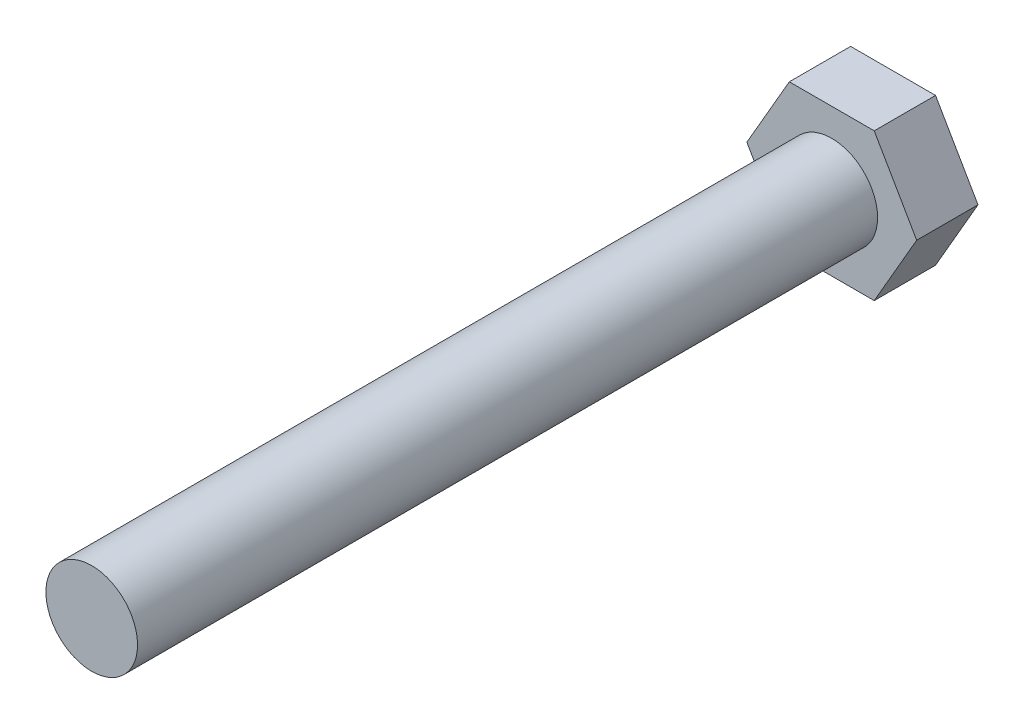
ISO-10303-21;
HEADER;
FILE_DESCRIPTION(('STEP AP214'),'2;1');
FILE_NAME('part.step','',(''),(''),'','','');
FILE_SCHEMA(('AUTOMOTIVE_DESIGN { 1 0 10303 214 1 1 1 1 }'));
ENDSEC;
DATA;
#1=APPLICATION_CONTEXT('core data for automotive mechanical design processes');
#2=APPLICATION_PROTOCOL_DEFINITION('international standard','automotive_design',2000,#1);
#3=PRODUCT_CONTEXT('',#1,'mechanical');
#4=PRODUCT('Part','Part','',(#3));
#5=PRODUCT_RELATED_PRODUCT_CATEGORY('part','',(#4));
#6=PRODUCT_DEFINITION_FORMATION('','',#4);
#7=PRODUCT_DEFINITION_CONTEXT('part definition',#1,'design');
#8=PRODUCT_DEFINITION('design','',#6,#7);
#9=PRODUCT_DEFINITION_SHAPE('','',#8);
#10=(LENGTH_UNIT() NAMED_UNIT(*) SI_UNIT(.MILLI.,.METRE.));
#11=(NAMED_UNIT(*) PLANE_ANGLE_UNIT() SI_UNIT($,.RADIAN.));
#12=(NAMED_UNIT(*) SI_UNIT($,.STERADIAN.) SOLID_ANGLE_UNIT());
#13=UNCERTAINTY_MEASURE_WITH_UNIT(LENGTH_MEASURE(1.E-05),#10,'distance_accuracy_value','');
#14=(GEOMETRIC_REPRESENTATION_CONTEXT(3) GLOBAL_UNCERTAINTY_ASSIGNED_CONTEXT((#13)) GLOBAL_UNIT_ASSIGNED_CONTEXT((#10,
#11,#12)) REPRESENTATION_CONTEXT('',''));
#15=CARTESIAN_POINT('',(0.,0.,0.));
#16=DIRECTION('',(0.,0.,1.));
#17=DIRECTION('',(1.,0.,0.));
#18=AXIS2_PLACEMENT_3D('',#15,#16,#17);
#19=CARTESIAN_POINT('',(0.,0.,63.));
#20=DIRECTION('',(0.,0.,-1.));
#21=DIRECTION('',(-1.,0.,0.));
#22=AXIS2_PLACEMENT_3D('',#19,#20,#21);
#23=CYLINDRICAL_SURFACE('',#22,3.9);
#24=CARTESIAN_POINT('',(0.,0.,63.));
#25=DIRECTION('',(0.,0.,1.));
#26=DIRECTION('',(1.,0.,0.));
#27=AXIS2_PLACEMENT_3D('',#24,#25,#26);
#28=CIRCLE('',#27,3.9);
#29=CARTESIAN_POINT('',(3.9,0.,63.));
#30=VERTEX_POINT('',#29);
#31=EDGE_CURVE('E11',#30,#30,#28,.T.);
#32=ORIENTED_EDGE('',*,*,#31,.F.);
#33=EDGE_LOOP('',(#32));
#34=FACE_BOUND('',#33,.T.);
#35=CARTESIAN_POINT('',(0.,0.,0.));
#36=DIRECTION('',(0.,0.,1.));
#37=DIRECTION('',(1.,0.,0.));
#38=AXIS2_PLACEMENT_3D('',#35,#36,#37);
#39=CIRCLE('',#38,3.9);
#40=CARTESIAN_POINT('',(3.9,0.,0.));
#41=VERTEX_POINT('',#40);
#42=EDGE_CURVE('E48',#41,#41,#39,.T.);
#43=ORIENTED_EDGE('',*,*,#42,.T.);
#44=EDGE_LOOP('',(#43));
#45=FACE_BOUND('',#44,.T.);
#46=ADVANCED_FACE('F45',(#34,#45),#23,.T.);
#47=CARTESIAN_POINT('',(0.,0.,63.));
#48=DIRECTION('',(0.,0.,1.));
#49=DIRECTION('',(1.,0.,0.));
#50=AXIS2_PLACEMENT_3D('',#47,#48,#49);
#51=PLANE('',#50);
#52=ORIENTED_EDGE('',*,*,#31,.T.);
#53=EDGE_LOOP('',(#52));
#54=FACE_BOUND('',#53,.T.);
#55=ADVANCED_FACE('F189',(#54),#51,.T.);
#56=CARTESIAN_POINT('',(-3.61421268512705,6.26000000000001,-5.22));
#57=DIRECTION('',(0.,-1.,0.));
#58=DIRECTION('',(1.,0.,0.));
#59=AXIS2_PLACEMENT_3D('',#56,#57,#58);
#60=PLANE('',#59);
#61=DIRECTION('',(1.,0.,0.));
#62=VECTOR('',#61,1.);
#63=CARTESIAN_POINT('',(-3.61421268512705,6.26000000000001,0.));
#64=LINE('',#63,#62);
#65=CARTESIAN_POINT('',(-3.61421268512705,6.26000000000001,0.));
#66=VERTEX_POINT('',#65);
#67=CARTESIAN_POINT('',(3.61421268512706,6.26000000000001,0.));
#68=VERTEX_POINT('',#67);
#69=EDGE_CURVE('E135',#66,#68,#64,.T.);
#70=ORIENTED_EDGE('',*,*,#69,.T.);
#71=DIRECTION('',(0.,0.,1.));
#72=VECTOR('',#71,1.);
#73=CARTESIAN_POINT('',(3.61421268512706,6.26000000000001,-5.22));
#74=LINE('',#73,#72);
#75=CARTESIAN_POINT('',(3.61421268512706,6.26000000000001,-5.22));
#76=VERTEX_POINT('',#75);
#77=EDGE_CURVE('E162',#76,#68,#74,.T.);
#78=ORIENTED_EDGE('',*,*,#77,.F.);
#79=DIRECTION('',(1.,0.,0.));
#80=VECTOR('',#79,1.);
#81=CARTESIAN_POINT('',(-3.61421268512705,6.26000000000001,-5.22));
#82=LINE('',#81,#80);
#83=CARTESIAN_POINT('',(-3.61421268512705,6.26000000000001,-5.22));
#84=VERTEX_POINT('',#83);
#85=EDGE_CURVE('E151',#84,#76,#82,.T.);
#86=ORIENTED_EDGE('',*,*,#85,.F.);
#87=DIRECTION('',(0.,0.,1.));
#88=VECTOR('',#87,1.);
#89=CARTESIAN_POINT('',(-3.61421268512705,6.26000000000001,-5.22));
#90=LINE('',#89,#88);
#91=EDGE_CURVE('E131',#84,#66,#90,.T.);
#92=ORIENTED_EDGE('',*,*,#91,.T.);
#93=EDGE_LOOP('',(#70,#78,#86,#92));
#94=FACE_BOUND('',#93,.T.);
#95=ADVANCED_FACE('F177',(#94),#60,.F.);
#96=CARTESIAN_POINT('',(3.61421268512706,6.26000000000001,-5.22));
#97=DIRECTION('',(-0.866025403784439,-0.5,0.));
#98=DIRECTION('',(0.5,-0.866025403784439,0.));
#99=AXIS2_PLACEMENT_3D('',#96,#97,#98);
#100=PLANE('',#99);
#101=DIRECTION('',(0.5,-0.866025403784439,0.));
#102=VECTOR('',#101,1.);
#103=CARTESIAN_POINT('',(3.61421268512706,6.26000000000001,0.));
#104=LINE('',#103,#102);
#105=CARTESIAN_POINT('',(7.22842537025412,0.,0.));
#106=VERTEX_POINT('',#105);
#107=EDGE_CURVE('E139',#68,#106,#104,.T.);
#108=ORIENTED_EDGE('',*,*,#107,.T.);
#109=DIRECTION('',(0.,0.,1.));
#110=VECTOR('',#109,1.);
#111=CARTESIAN_POINT('',(7.22842537025412,0.,-5.22));
#112=LINE('',#111,#110);
#113=CARTESIAN_POINT('',(7.22842537025412,0.,-5.22));
#114=VERTEX_POINT('',#113);
#115=EDGE_CURVE('E158',#114,#106,#112,.T.);
#116=ORIENTED_EDGE('',*,*,#115,.F.);
#117=DIRECTION('',(0.5,-0.866025403784439,0.));
#118=VECTOR('',#117,1.);
#119=CARTESIAN_POINT('',(3.61421268512706,6.26000000000001,-5.22));
#120=LINE('',#119,#118);
#121=EDGE_CURVE('E100',#76,#114,#120,.T.);
#122=ORIENTED_EDGE('',*,*,#121,.F.);
#123=ORIENTED_EDGE('',*,*,#77,.T.);
#124=EDGE_LOOP('',(#108,#116,#122,#123));
#125=FACE_BOUND('',#124,.T.);
#126=ADVANCED_FACE('F199',(#125),#100,.F.);
#127=CARTESIAN_POINT('',(7.22842537025412,0.,-5.22));
#128=DIRECTION('',(-0.866025403784438,0.5,0.));
#129=DIRECTION('',(-0.5,-0.866025403784439,0.));
#130=AXIS2_PLACEMENT_3D('',#127,#128,#129);
#131=PLANE('',#130);
#132=DIRECTION('',(-0.5,-0.866025403784438,0.));
#133=VECTOR('',#132,1.);
#134=CARTESIAN_POINT('',(7.22842537025412,0.,0.));
#135=LINE('',#134,#133);
#136=CARTESIAN_POINT('',(3.61421268512706,-6.26,0.));
#137=VERTEX_POINT('',#136);
#138=EDGE_CURVE('E142',#106,#137,#135,.T.);
#139=ORIENTED_EDGE('',*,*,#138,.T.);
#140=DIRECTION('',(0.,0.,1.));
#141=VECTOR('',#140,1.);
#142=CARTESIAN_POINT('',(3.61421268512706,-6.26,-5.22));
#143=LINE('',#142,#141);
#144=CARTESIAN_POINT('',(3.61421268512706,-6.26,-5.22));
#145=VERTEX_POINT('',#144);
#146=EDGE_CURVE('E124',#145,#137,#143,.T.);
#147=ORIENTED_EDGE('',*,*,#146,.F.);
#148=DIRECTION('',(-0.5,-0.866025403784438,0.));
#149=VECTOR('',#148,1.);
#150=CARTESIAN_POINT('',(7.22842537025412,0.,-5.22));
#151=LINE('',#150,#149);
#152=EDGE_CURVE('E113',#114,#145,#151,.T.);
#153=ORIENTED_EDGE('',*,*,#152,.F.);
#154=ORIENTED_EDGE('',*,*,#115,.T.);
#155=EDGE_LOOP('',(#139,#147,#153,#154));
#156=FACE_BOUND('',#155,.T.);
#157=ADVANCED_FACE('F204',(#156),#131,.F.);
#158=CARTESIAN_POINT('',(3.61421268512706,-6.26,-5.22));
#159=DIRECTION('',(0.,1.,0.));
#160=DIRECTION('',(-1.,0.,0.));
#161=AXIS2_PLACEMENT_3D('',#158,#159,#160);
#162=PLANE('',#161);
#163=DIRECTION('',(-1.,0.,0.));
#164=VECTOR('',#163,1.);
#165=CARTESIAN_POINT('',(3.61421268512706,-6.26,0.));
#166=LINE('',#165,#164);
#167=CARTESIAN_POINT('',(-3.61421268512705,-6.26,0.));
#168=VERTEX_POINT('',#167);
#169=EDGE_CURVE('E122',#137,#168,#166,.T.);
#170=ORIENTED_EDGE('',*,*,#169,.T.);
#171=DIRECTION('',(0.,0.,1.));
#172=VECTOR('',#171,1.);
#173=CARTESIAN_POINT('',(-3.61421268512705,-6.26,-5.22));
#174=LINE('',#173,#172);
#175=CARTESIAN_POINT('',(-3.61421268512705,-6.26,-5.22));
#176=VERTEX_POINT('',#175);
#177=EDGE_CURVE('E119',#176,#168,#174,.T.);
#178=ORIENTED_EDGE('',*,*,#177,.F.);
#179=DIRECTION('',(-1.,0.,0.));
#180=VECTOR('',#179,1.);
#181=CARTESIAN_POINT('',(3.61421268512706,-6.26,-5.22));
#182=LINE('',#181,#180);
#183=EDGE_CURVE('E107',#145,#176,#182,.T.);
#184=ORIENTED_EDGE('',*,*,#183,.F.);
#185=ORIENTED_EDGE('',*,*,#146,.T.);
#186=EDGE_LOOP('',(#170,#178,#184,#185));
#187=FACE_BOUND('',#186,.T.);
#188=ADVANCED_FACE('F120',(#187),#162,.F.);
#189=CARTESIAN_POINT('',(-3.61421268512705,-6.26,-5.22));
#190=DIRECTION('',(0.866025403784439,0.5,0.));
#191=DIRECTION('',(-0.5,0.866025403784439,0.));
#192=AXIS2_PLACEMENT_3D('',#189,#190,#191);
#193=PLANE('',#192);
#194=DIRECTION('',(-0.5,0.866025403784439,0.));
#195=VECTOR('',#194,1.);
#196=CARTESIAN_POINT('',(-3.61421268512705,-6.26,0.));
#197=LINE('',#196,#195);
#198=CARTESIAN_POINT('',(-7.22842537025411,0.,0.));
#199=VERTEX_POINT('',#198);
#200=EDGE_CURVE('E85',#168,#199,#197,.T.);
#201=ORIENTED_EDGE('',*,*,#200,.T.);
#202=DIRECTION('',(0.,0.,1.));
#203=VECTOR('',#202,1.);
#204=CARTESIAN_POINT('',(-7.22842537025411,0.,-5.22));
#205=LINE('',#204,#203);
#206=CARTESIAN_POINT('',(-7.22842537025411,0.,-5.22));
#207=VERTEX_POINT('',#206);
#208=EDGE_CURVE('E125',#207,#199,#205,.T.);
#209=ORIENTED_EDGE('',*,*,#208,.F.);
#210=DIRECTION('',(-0.5,0.866025403784439,0.));
#211=VECTOR('',#210,1.);
#212=CARTESIAN_POINT('',(-3.61421268512705,-6.26,-5.22));
#213=LINE('',#212,#211);
#214=EDGE_CURVE('E111',#176,#207,#213,.T.);
#215=ORIENTED_EDGE('',*,*,#214,.F.);
#216=ORIENTED_EDGE('',*,*,#177,.T.);
#217=EDGE_LOOP('',(#201,#209,#215,#216));
#218=FACE_BOUND('',#217,.T.);
#219=ADVANCED_FACE('F127',(#218),#193,.F.);
#220=CARTESIAN_POINT('',(-7.22842537025411,0.,-5.22));
#221=DIRECTION('',(0.866025403784438,-0.5,0.));
#222=DIRECTION('',(0.5,0.866025403784439,0.));
#223=AXIS2_PLACEMENT_3D('',#220,#221,#222);
#224=PLANE('',#223);
#225=DIRECTION('',(0.5,0.866025403784438,0.));
#226=VECTOR('',#225,1.);
#227=CARTESIAN_POINT('',(-7.22842537025411,0.,0.));
#228=LINE('',#227,#226);
#229=EDGE_CURVE('E91',#199,#66,#228,.T.);
#230=ORIENTED_EDGE('',*,*,#229,.T.);
#231=ORIENTED_EDGE('',*,*,#91,.F.);
#232=DIRECTION('',(0.5,0.866025403784438,0.));
#233=VECTOR('',#232,1.);
#234=CARTESIAN_POINT('',(-7.22842537025411,0.,-5.22));
#235=LINE('',#234,#233);
#236=EDGE_CURVE('E62',#207,#84,#235,.T.);
#237=ORIENTED_EDGE('',*,*,#236,.F.);
#238=ORIENTED_EDGE('',*,*,#208,.T.);
#239=EDGE_LOOP('',(#230,#231,#237,#238));
#240=FACE_BOUND('',#239,.T.);
#241=ADVANCED_FACE('F179',(#240),#224,.F.);
#242=CARTESIAN_POINT('',(0.,0.,-5.22));
#243=DIRECTION('',(0.,0.,-1.));
#244=DIRECTION('',(-1.,0.,0.));
#245=AXIS2_PLACEMENT_3D('',#242,#243,#244);
#246=PLANE('',#245);
#247=ORIENTED_EDGE('',*,*,#85,.T.);
#248=ORIENTED_EDGE('',*,*,#121,.T.);
#249=ORIENTED_EDGE('',*,*,#152,.T.);
#250=ORIENTED_EDGE('',*,*,#183,.T.);
#251=ORIENTED_EDGE('',*,*,#214,.T.);
#252=ORIENTED_EDGE('',*,*,#236,.T.);
#253=EDGE_LOOP('',(#247,#248,#249,#250,#251,#252));
#254=FACE_BOUND('',#253,.T.);
#255=ADVANCED_FACE('F109',(#254),#246,.T.);
#256=CARTESIAN_POINT('',(0.,0.,0.));
#257=DIRECTION('',(0.,0.,-1.));
#258=DIRECTION('',(-1.,0.,0.));
#259=AXIS2_PLACEMENT_3D('',#256,#257,#258);
#260=PLANE('',#259);
#261=ORIENTED_EDGE('',*,*,#42,.F.);
#262=EDGE_LOOP('',(#261));
#263=FACE_BOUND('',#262,.T.);
#264=ORIENTED_EDGE('',*,*,#69,.F.);
#265=ORIENTED_EDGE('',*,*,#229,.F.);
#266=ORIENTED_EDGE('',*,*,#200,.F.);
#267=ORIENTED_EDGE('',*,*,#169,.F.);
#268=ORIENTED_EDGE('',*,*,#138,.F.);
#269=ORIENTED_EDGE('',*,*,#107,.F.);
#270=EDGE_LOOP('',(#264,#265,#266,#267,#268,#269));
#271=FACE_BOUND('',#270,.T.);
#272=ADVANCED_FACE('F170',(#263,#271),#260,.F.);
#273=CLOSED_SHELL('',(#46,#55,#95,#126,#157,#188,#219,#241,#255,#272));
#274=MANIFOLD_SOLID_BREP('B2',#273);
#275=ADVANCED_BREP_SHAPE_REPRESENTATION('',(#18,#274),#14);
#276=SHAPE_DEFINITION_REPRESENTATION(#9,#275);
ENDSEC;
END-ISO-10303-21;
